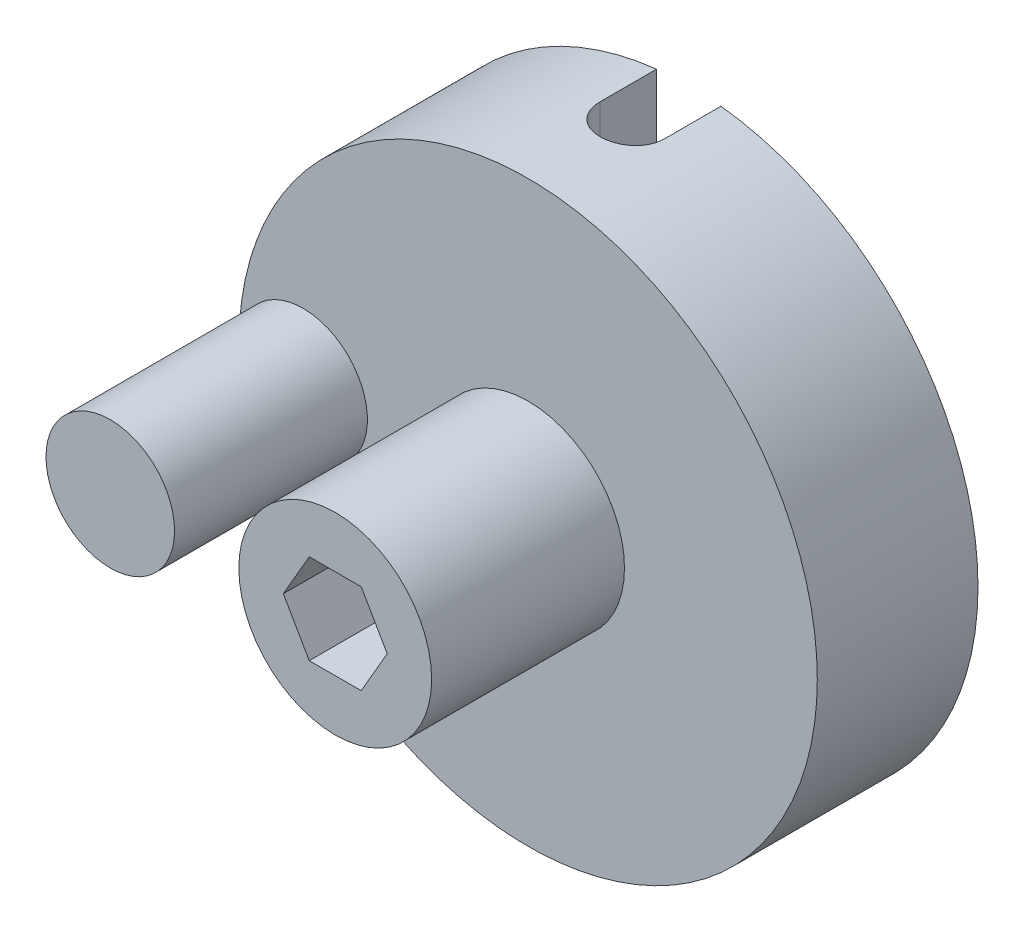
ISO-10303-21;
HEADER;
FILE_DESCRIPTION(('STEP AP214'),'2;1');
FILE_NAME('part.step','',(''),(''),'','','');
FILE_SCHEMA(('AUTOMOTIVE_DESIGN { 1 0 10303 214 1 1 1 1 }'));
ENDSEC;
DATA;
#1=APPLICATION_CONTEXT('core data for automotive mechanical design processes');
#2=APPLICATION_PROTOCOL_DEFINITION('international standard','automotive_design',2000,#1);
#3=PRODUCT_CONTEXT('',#1,'mechanical');
#4=PRODUCT('Part','Part','',(#3));
#5=PRODUCT_RELATED_PRODUCT_CATEGORY('part','',(#4));
#6=PRODUCT_DEFINITION_FORMATION('','',#4);
#7=PRODUCT_DEFINITION_CONTEXT('part definition',#1,'design');
#8=PRODUCT_DEFINITION('design','',#6,#7);
#9=PRODUCT_DEFINITION_SHAPE('','',#8);
#10=(LENGTH_UNIT() NAMED_UNIT(*) SI_UNIT(.MILLI.,.METRE.));
#11=(NAMED_UNIT(*) PLANE_ANGLE_UNIT() SI_UNIT($,.RADIAN.));
#12=(NAMED_UNIT(*) SI_UNIT($,.STERADIAN.) SOLID_ANGLE_UNIT());
#13=UNCERTAINTY_MEASURE_WITH_UNIT(LENGTH_MEASURE(1.E-05),#10,'distance_accuracy_value','');
#14=(GEOMETRIC_REPRESENTATION_CONTEXT(3) GLOBAL_UNCERTAINTY_ASSIGNED_CONTEXT((#13)) GLOBAL_UNIT_ASSIGNED_CONTEXT((#10,
#11,#12)) REPRESENTATION_CONTEXT('',''));
#15=CARTESIAN_POINT('',(0.,0.,0.));
#16=DIRECTION('',(0.,0.,1.));
#17=DIRECTION('',(1.,0.,0.));
#18=AXIS2_PLACEMENT_3D('',#15,#16,#17);
#19=CARTESIAN_POINT('',(-0.808290376865476,1.4,0.));
#20=DIRECTION('',(-0.866025403784439,0.5,0.));
#21=DIRECTION('',(-0.5,-0.866025403784439,0.));
#22=AXIS2_PLACEMENT_3D('',#19,#20,#21);
#23=PLANE('',#22);
#24=DIRECTION('',(-0.5,-0.866025403784439,0.));
#25=VECTOR('',#24,1.);
#26=CARTESIAN_POINT('',(-0.808290376865476,1.4,3.));
#27=LINE('',#26,#25);
#28=CARTESIAN_POINT('',(-0.808290376865477,1.4,3.));
#29=VERTEX_POINT('',#28);
#30=CARTESIAN_POINT('',(-1.61658075373095,0.,3.));
#31=VERTEX_POINT('',#30);
#32=EDGE_CURVE('E299',#29,#31,#27,.T.);
#33=ORIENTED_EDGE('',*,*,#32,.F.);
#34=DIRECTION('',(0.,0.,1.));
#35=VECTOR('',#34,1.);
#36=CARTESIAN_POINT('',(-0.808290376865476,1.4,0.));
#37=LINE('',#36,#35);
#38=CARTESIAN_POINT('',(-0.808290376865476,1.4,11.));
#39=VERTEX_POINT('',#38);
#40=EDGE_CURVE('E320',#29,#39,#37,.T.);
#41=ORIENTED_EDGE('',*,*,#40,.T.);
#42=DIRECTION('',(-0.5,-0.866025403784439,0.));
#43=VECTOR('',#42,1.);
#44=CARTESIAN_POINT('',(-0.808290376865476,1.4,11.));
#45=LINE('',#44,#43);
#46=CARTESIAN_POINT('',(-1.61658075373095,0.,11.));
#47=VERTEX_POINT('',#46);
#48=EDGE_CURVE('E301',#39,#47,#45,.T.);
#49=ORIENTED_EDGE('',*,*,#48,.T.);
#50=DIRECTION('',(0.,0.,1.));
#51=VECTOR('',#50,1.);
#52=CARTESIAN_POINT('',(-1.61658075373095,0.,0.));
#53=LINE('',#52,#51);
#54=EDGE_CURVE('E319',#31,#47,#53,.T.);
#55=ORIENTED_EDGE('',*,*,#54,.F.);
#56=EDGE_LOOP('',(#33,#41,#49,#55));
#57=FACE_BOUND('',#56,.T.);
#58=ADVANCED_FACE('F31',(#57),#23,.F.);
#59=CARTESIAN_POINT('',(0.808290376865476,1.4,0.));
#60=DIRECTION('',(0.,1.,0.));
#61=DIRECTION('',(0.,0.,1.));
#62=AXIS2_PLACEMENT_3D('',#59,#60,#61);
#63=PLANE('',#62);
#64=DIRECTION('',(-1.,0.,0.));
#65=VECTOR('',#64,1.);
#66=CARTESIAN_POINT('',(0.808290376865476,1.4,3.));
#67=LINE('',#66,#65);
#68=CARTESIAN_POINT('',(0.808290376865476,1.4,3.));
#69=VERTEX_POINT('',#68);
#70=EDGE_CURVE('E297',#69,#29,#67,.T.);
#71=ORIENTED_EDGE('',*,*,#70,.F.);
#72=DIRECTION('',(0.,0.,1.));
#73=VECTOR('',#72,1.);
#74=CARTESIAN_POINT('',(0.808290376865476,1.4,0.));
#75=LINE('',#74,#73);
#76=CARTESIAN_POINT('',(0.808290376865476,1.4,11.));
#77=VERTEX_POINT('',#76);
#78=EDGE_CURVE('E323',#69,#77,#75,.T.);
#79=ORIENTED_EDGE('',*,*,#78,.T.);
#80=DIRECTION('',(-1.,0.,0.));
#81=VECTOR('',#80,1.);
#82=CARTESIAN_POINT('',(0.808290376865476,1.4,11.));
#83=LINE('',#82,#81);
#84=EDGE_CURVE('E316',#77,#39,#83,.T.);
#85=ORIENTED_EDGE('',*,*,#84,.T.);
#86=ORIENTED_EDGE('',*,*,#40,.F.);
#87=EDGE_LOOP('',(#71,#79,#85,#86));
#88=FACE_BOUND('',#87,.T.);
#89=ADVANCED_FACE('F218',(#88),#63,.F.);
#90=CARTESIAN_POINT('',(1.61658075373095,0.,0.));
#91=DIRECTION('',(0.866025403784438,0.5,0.));
#92=DIRECTION('',(-0.5,0.866025403784439,0.));
#93=AXIS2_PLACEMENT_3D('',#90,#91,#92);
#94=PLANE('',#93);
#95=DIRECTION('',(-0.5,0.866025403784439,0.));
#96=VECTOR('',#95,1.);
#97=CARTESIAN_POINT('',(1.61658075373095,0.,3.));
#98=LINE('',#97,#96);
#99=CARTESIAN_POINT('',(1.61658075373095,0.,3.));
#100=VERTEX_POINT('',#99);
#101=EDGE_CURVE('E295',#100,#69,#98,.T.);
#102=ORIENTED_EDGE('',*,*,#101,.F.);
#103=DIRECTION('',(0.,0.,1.));
#104=VECTOR('',#103,1.);
#105=CARTESIAN_POINT('',(1.61658075373095,0.,0.));
#106=LINE('',#105,#104);
#107=CARTESIAN_POINT('',(1.61658075373095,0.,11.));
#108=VERTEX_POINT('',#107);
#109=EDGE_CURVE('E325',#100,#108,#106,.T.);
#110=ORIENTED_EDGE('',*,*,#109,.T.);
#111=DIRECTION('',(-0.5,0.866025403784439,0.));
#112=VECTOR('',#111,1.);
#113=CARTESIAN_POINT('',(1.61658075373095,0.,11.));
#114=LINE('',#113,#112);
#115=EDGE_CURVE('E313',#108,#77,#114,.T.);
#116=ORIENTED_EDGE('',*,*,#115,.T.);
#117=ORIENTED_EDGE('',*,*,#78,.F.);
#118=EDGE_LOOP('',(#102,#110,#116,#117));
#119=FACE_BOUND('',#118,.T.);
#120=ADVANCED_FACE('F221',(#119),#94,.F.);
#121=CARTESIAN_POINT('',(0.808290376865476,-1.4,0.));
#122=DIRECTION('',(0.866025403784439,-0.5,0.));
#123=DIRECTION('',(0.5,0.866025403784439,0.));
#124=AXIS2_PLACEMENT_3D('',#121,#122,#123);
#125=PLANE('',#124);
#126=DIRECTION('',(0.5,0.866025403784439,0.));
#127=VECTOR('',#126,1.);
#128=CARTESIAN_POINT('',(0.808290376865476,-1.4,3.));
#129=LINE('',#128,#127);
#130=CARTESIAN_POINT('',(0.808290376865477,-1.4,3.));
#131=VERTEX_POINT('',#130);
#132=EDGE_CURVE('E293',#131,#100,#129,.T.);
#133=ORIENTED_EDGE('',*,*,#132,.F.);
#134=DIRECTION('',(0.,0.,1.));
#135=VECTOR('',#134,1.);
#136=CARTESIAN_POINT('',(0.808290376865476,-1.4,0.));
#137=LINE('',#136,#135);
#138=CARTESIAN_POINT('',(0.808290376865476,-1.4,11.));
#139=VERTEX_POINT('',#138);
#140=EDGE_CURVE('E327',#131,#139,#137,.T.);
#141=ORIENTED_EDGE('',*,*,#140,.T.);
#142=DIRECTION('',(0.5,0.866025403784439,0.));
#143=VECTOR('',#142,1.);
#144=CARTESIAN_POINT('',(0.808290376865476,-1.4,11.));
#145=LINE('',#144,#143);
#146=EDGE_CURVE('E310',#139,#108,#145,.T.);
#147=ORIENTED_EDGE('',*,*,#146,.T.);
#148=ORIENTED_EDGE('',*,*,#109,.F.);
#149=EDGE_LOOP('',(#133,#141,#147,#148));
#150=FACE_BOUND('',#149,.T.);
#151=ADVANCED_FACE('F225',(#150),#125,.F.);
#152=CARTESIAN_POINT('',(-0.808290376865476,-1.4,0.));
#153=DIRECTION('',(0.,-1.,0.));
#154=DIRECTION('',(0.,0.,-1.));
#155=AXIS2_PLACEMENT_3D('',#152,#153,#154);
#156=PLANE('',#155);
#157=DIRECTION('',(1.,0.,0.));
#158=VECTOR('',#157,1.);
#159=CARTESIAN_POINT('',(-0.808290376865476,-1.4,3.));
#160=LINE('',#159,#158);
#161=CARTESIAN_POINT('',(-0.808290376865476,-1.4,3.));
#162=VERTEX_POINT('',#161);
#163=EDGE_CURVE('E280',#162,#131,#160,.T.);
#164=ORIENTED_EDGE('',*,*,#163,.F.);
#165=DIRECTION('',(0.,0.,1.));
#166=VECTOR('',#165,1.);
#167=CARTESIAN_POINT('',(-0.808290376865476,-1.4,0.));
#168=LINE('',#167,#166);
#169=CARTESIAN_POINT('',(-0.808290376865476,-1.4,11.));
#170=VERTEX_POINT('',#169);
#171=EDGE_CURVE('E329',#162,#170,#168,.T.);
#172=ORIENTED_EDGE('',*,*,#171,.T.);
#173=DIRECTION('',(1.,0.,0.));
#174=VECTOR('',#173,1.);
#175=CARTESIAN_POINT('',(-0.808290376865476,-1.4,11.));
#176=LINE('',#175,#174);
#177=EDGE_CURVE('E307',#170,#139,#176,.T.);
#178=ORIENTED_EDGE('',*,*,#177,.T.);
#179=ORIENTED_EDGE('',*,*,#140,.F.);
#180=EDGE_LOOP('',(#164,#172,#178,#179));
#181=FACE_BOUND('',#180,.T.);
#182=ADVANCED_FACE('F229',(#181),#156,.F.);
#183=CARTESIAN_POINT('',(-1.61658075373095,0.,0.));
#184=DIRECTION('',(-0.866025403784439,-0.5,0.));
#185=DIRECTION('',(0.5,-0.866025403784439,0.));
#186=AXIS2_PLACEMENT_3D('',#183,#184,#185);
#187=PLANE('',#186);
#188=DIRECTION('',(0.5,-0.866025403784439,0.));
#189=VECTOR('',#188,1.);
#190=CARTESIAN_POINT('',(-1.61658075373095,0.,3.));
#191=LINE('',#190,#189);
#192=EDGE_CURVE('E40',#31,#162,#191,.T.);
#193=ORIENTED_EDGE('',*,*,#192,.F.);
#194=ORIENTED_EDGE('',*,*,#54,.T.);
#195=DIRECTION('',(0.5,-0.866025403784439,0.));
#196=VECTOR('',#195,1.);
#197=CARTESIAN_POINT('',(-1.61658075373095,0.,11.));
#198=LINE('',#197,#196);
#199=EDGE_CURVE('E304',#47,#170,#198,.T.);
#200=ORIENTED_EDGE('',*,*,#199,.T.);
#201=ORIENTED_EDGE('',*,*,#171,.F.);
#202=EDGE_LOOP('',(#193,#194,#200,#201));
#203=FACE_BOUND('',#202,.T.);
#204=ADVANCED_FACE('F233',(#203),#187,.F.);
#205=CARTESIAN_POINT('',(0.,0.,5.));
#206=DIRECTION('',(0.,0.,1.));
#207=DIRECTION('',(1.,0.,0.));
#208=AXIS2_PLACEMENT_3D('',#205,#206,#207);
#209=PLANE('',#208);
#210=CARTESIAN_POINT('',(0.,0.,5.));
#211=DIRECTION('',(0.,0.,1.));
#212=DIRECTION('',(1.,0.,0.));
#213=AXIS2_PLACEMENT_3D('',#210,#211,#212);
#214=CIRCLE('',#213,3.);
#215=CARTESIAN_POINT('',(3.,0.,5.));
#216=VERTEX_POINT('',#215);
#217=EDGE_CURVE('E335',#216,#216,#214,.T.);
#218=ORIENTED_EDGE('',*,*,#217,.F.);
#219=EDGE_LOOP('',(#218));
#220=FACE_BOUND('',#219,.T.);
#221=CARTESIAN_POINT('',(0.,0.,5.));
#222=DIRECTION('',(0.,0.,1.));
#223=DIRECTION('',(1.,0.,0.));
#224=AXIS2_PLACEMENT_3D('',#221,#222,#223);
#225=CIRCLE('',#224,9.);
#226=CARTESIAN_POINT('',(-9.,0.,5.));
#227=VERTEX_POINT('',#226);
#228=EDGE_CURVE('E343',#227,#227,#225,.T.);
#229=ORIENTED_EDGE('',*,*,#228,.T.);
#230=CARTESIAN_POINT('',(-7.,0.,5.));
#231=DIRECTION('',(0.,0.,1.));
#232=DIRECTION('',(1.,0.,0.));
#233=AXIS2_PLACEMENT_3D('',#230,#231,#232);
#234=CIRCLE('',#233,2.);
#235=EDGE_CURVE('E322',#227,#227,#234,.T.);
#236=ORIENTED_EDGE('',*,*,#235,.F.);
#237=EDGE_LOOP('',(#229,#236));
#238=FACE_BOUND('',#237,.T.);
#239=ADVANCED_FACE('F237',(#220,#238),#209,.T.);
#240=CARTESIAN_POINT('',(0.,0.,5.));
#241=DIRECTION('',(0.,0.,-1.));
#242=DIRECTION('',(-1.,0.,0.));
#243=AXIS2_PLACEMENT_3D('',#240,#241,#242);
#244=CYLINDRICAL_SURFACE('',#243,9.);
#245=ORIENTED_EDGE('',*,*,#228,.F.);
#246=EDGE_LOOP('',(#245));
#247=FACE_BOUND('',#246,.T.);
#248=CARTESIAN_POINT('',(0.,0.,0.));
#249=DIRECTION('',(0.,0.,1.));
#250=DIRECTION('',(1.,0.,0.));
#251=AXIS2_PLACEMENT_3D('',#248,#249,#250);
#252=CIRCLE('',#251,9.);
#253=CARTESIAN_POINT('',(-0.999999999999998,8.94427190999916,0.));
#254=VERTEX_POINT('',#253);
#255=CARTESIAN_POINT('',(1.,8.94427190999916,0.));
#256=VERTEX_POINT('',#255);
#257=EDGE_CURVE('E340',#254,#256,#252,.T.);
#258=ORIENTED_EDGE('',*,*,#257,.T.);
#259=DIRECTION('',(0.,0.,-1.));
#260=VECTOR('',#259,1.);
#261=CARTESIAN_POINT('',(1.,8.94427190999916,5.));
#262=LINE('',#261,#260);
#263=CARTESIAN_POINT('',(1.,8.94427190999916,1.75624966868781));
#264=VERTEX_POINT('',#263);
#265=EDGE_CURVE('E177',#256,#264,#262,.F.);
#266=ORIENTED_EDGE('',*,*,#265,.T.);
#267=CARTESIAN_POINT('',(1.,8.94427190999916,1.75624966868781));
#268=CARTESIAN_POINT('',(0.999999916663173,8.94427115416526,1.78429133160942));
#269=CARTESIAN_POINT('',(0.998819755404154,8.94440395043972,1.81231947522258));
#270=CARTESIAN_POINT('',(0.994112290071172,8.94492867723731,1.86817349896722));
#271=CARTESIAN_POINT('',(0.990585152282366,8.94532058940187,1.89599939328704));
#272=CARTESIAN_POINT('',(0.976519887916943,8.9468711629412,1.97881472627213));
#273=CARTESIAN_POINT('',(0.962497798537733,8.94840471911578,2.03324672375495));
#274=CARTESIAN_POINT('',(0.925564954935866,8.95229970936664,2.1389639463873));
#275=CARTESIAN_POINT('',(0.902651036418025,8.9546614381321,2.19024804377473));
#276=CARTESIAN_POINT('',(0.848592815070569,8.95994559153617,2.28824558603894));
#277=CARTESIAN_POINT('',(0.817449357990867,8.9628679585495,2.33495949991802));
#278=CARTESIAN_POINT('',(0.74767213384802,8.96895834846973,2.42268832970838));
#279=CARTESIAN_POINT('',(0.709009815966534,8.97212727921224,2.46368046599398));
#280=CARTESIAN_POINT('',(0.625348520349966,8.97834591313882,2.53861343115112));
#281=CARTESIAN_POINT('',(0.580348579191626,8.98139559810534,2.57255318599897));
#282=CARTESIAN_POINT('',(0.48514905414561,8.9870410281107,2.63249299378261));
#283=CARTESIAN_POINT('',(0.434936368504785,8.98963558298816,2.65847235889332));
#284=CARTESIAN_POINT('',(0.330830504554187,8.99406818174326,2.70162030391601));
#285=CARTESIAN_POINT('',(0.276937655877063,8.99590629327227,2.71878967177067));
#286=CARTESIAN_POINT('',(0.167234674124459,8.99861262236768,2.74376376625514));
#287=CARTESIAN_POINT('',(0.111433378381948,8.99948481412383,2.75160687483939));
#288=CARTESIAN_POINT('',(-0.000701187042490368,9.00017458214887,2.75782470520331));
#289=CARTESIAN_POINT('',(-0.0570344528927511,8.9999921660081,2.7561994951294));
#290=CARTESIAN_POINT('',(-0.168370018408367,8.99859646961496,2.74355747129341));
#291=CARTESIAN_POINT('',(-0.223377100451679,8.99738774941592,2.73258220080991));
#292=CARTESIAN_POINT('',(-0.330763409468756,8.9940804590329,2.70161646145195));
#293=CARTESIAN_POINT('',(-0.383142609178625,8.99198187961889,2.68162589906664));
#294=CARTESIAN_POINT('',(-0.483917540161101,8.9871228456453,2.63315163900534));
#295=CARTESIAN_POINT('',(-0.532304358111638,8.98436096120363,2.60464956035006));
#296=CARTESIAN_POINT('',(-0.623621368948409,8.9784850191985,2.53997590987187));
#297=CARTESIAN_POINT('',(-0.666551602030159,8.9753709642296,2.50380439455052));
#298=CARTESIAN_POINT('',(-0.745977303006888,8.96912017299343,2.42459118944073));
#299=CARTESIAN_POINT('',(-0.782437642872812,8.96598340371819,2.38151427532033));
#300=CARTESIAN_POINT('',(-0.847626568506839,8.96005605482345,2.28981665745839));
#301=CARTESIAN_POINT('',(-0.876352825703826,8.95726557960189,2.24119429035532));
#302=CARTESIAN_POINT('',(-0.925258151139518,8.95234630600339,2.13975072441991));
#303=CARTESIAN_POINT('',(-0.945429663936238,8.9502180929678,2.08692586268584));
#304=CARTESIAN_POINT('',(-0.976576500550566,8.94687363542662,1.97864881146696));
#305=CARTESIAN_POINT('',(-0.987565708258682,8.94565601437542,1.92320072300691));
#306=CARTESIAN_POINT('',(-0.995878229146715,8.9447318694184,1.84884156747438));
#307=CARTESIAN_POINT('',(-0.997424646598037,8.94455949934616,1.83034097667583));
#308=CARTESIAN_POINT('',(-0.999484141877985,8.94432965826436,1.79331273511982));
#309=CARTESIAN_POINT('',(-0.999998947367566,8.94427199515397,1.77478518169361));
#310=CARTESIAN_POINT('',(-0.999999999999998,8.94427190999916,1.75624966868782));
#311=B_SPLINE_CURVE_WITH_KNOTS('',3,(#267,#268,#269,#270,#271,#272,#273,#274,#275,#276,#277,
#278,#279,#280,#281,#282,#283,#284,#285,#286,#287,#288,#289,#290,#291,#292,#293,#294,#295,#296,
#297,#298,#299,#300,#301,#302,#303,#304,#305,#306,#307,#308,#309,#310),.UNSPECIFIED.,.F.,.F.,(4,
2,2,2,2,2,2,2,2,2,2,2,2,2,2,2,2,2,2,2,2,4),(0.,0.0840730446599406,0.168140133311819,
0.335963609492455,0.503846863107502,0.671712870061393,0.840229207400693,1.00877118970891,
1.17774754254328,1.3467087799477,1.51497222864922,1.68323446630792,1.85075297343597,
2.01827321818486,2.18615787881024,2.35404130265442,2.5228100698145,2.69162959305411,
2.86059790661905,3.02931027087838,3.08498698762154,3.14057038327783),.UNSPECIFIED.);
#312=CARTESIAN_POINT('',(-0.999999999999998,8.94427190999916,1.75624966868781));
#313=VERTEX_POINT('',#312);
#314=EDGE_CURVE('E152',#264,#313,#311,.T.);
#315=ORIENTED_EDGE('',*,*,#314,.T.);
#316=DIRECTION('',(0.,0.,-1.));
#317=VECTOR('',#316,1.);
#318=CARTESIAN_POINT('',(-0.999999999999998,8.94427190999916,5.));
#319=LINE('',#318,#317);
#320=EDGE_CURVE('E173',#313,#254,#319,.T.);
#321=ORIENTED_EDGE('',*,*,#320,.T.);
#322=EDGE_LOOP('',(#258,#266,#315,#321));
#323=FACE_BOUND('',#322,.T.);
#324=ADVANCED_FACE('F33',(#247,#323),#244,.T.);
#325=CARTESIAN_POINT('',(0.,0.,0.));
#326=DIRECTION('',(0.,0.,1.));
#327=DIRECTION('',(1.,0.,0.));
#328=AXIS2_PLACEMENT_3D('',#325,#326,#327);
#329=PLANE('',#328);
#330=DIRECTION('',(1.,0.,0.));
#331=VECTOR('',#330,1.);
#332=CARTESIAN_POINT('',(-2.04959345562317,3.55,0.));
#333=LINE('',#332,#331);
#334=CARTESIAN_POINT('',(1.,3.55,0.));
#335=VERTEX_POINT('',#334);
#336=CARTESIAN_POINT('',(2.04959345562317,3.55,0.));
#337=VERTEX_POINT('',#336);
#338=EDGE_CURVE('E266',#335,#337,#333,.T.);
#339=ORIENTED_EDGE('',*,*,#338,.F.);
#340=DIRECTION('',(0.,1.,0.));
#341=VECTOR('',#340,1.);
#342=CARTESIAN_POINT('',(1.,0.,0.));
#343=LINE('',#342,#341);
#344=EDGE_CURVE('E160',#335,#256,#343,.T.);
#345=ORIENTED_EDGE('',*,*,#344,.T.);
#346=ORIENTED_EDGE('',*,*,#257,.F.);
#347=DIRECTION('',(0.,-1.,0.));
#348=VECTOR('',#347,1.);
#349=CARTESIAN_POINT('',(-1.,0.,0.));
#350=LINE('',#349,#348);
#351=CARTESIAN_POINT('',(-0.999999999999999,3.55,0.));
#352=VERTEX_POINT('',#351);
#353=EDGE_CURVE('E155',#254,#352,#350,.T.);
#354=ORIENTED_EDGE('',*,*,#353,.T.);
#355=CARTESIAN_POINT('',(-2.04959345562317,3.55,0.));
#356=VERTEX_POINT('',#355);
#357=EDGE_CURVE('E270',#356,#352,#333,.T.);
#358=ORIENTED_EDGE('',*,*,#357,.F.);
#359=DIRECTION('',(0.5,0.866025403784439,0.));
#360=VECTOR('',#359,1.);
#361=CARTESIAN_POINT('',(-4.09918691124634,0.,0.));
#362=LINE('',#361,#360);
#363=CARTESIAN_POINT('',(-4.09918691124634,0.,0.));
#364=VERTEX_POINT('',#363);
#365=EDGE_CURVE('E271',#364,#356,#362,.T.);
#366=ORIENTED_EDGE('',*,*,#365,.F.);
#367=DIRECTION('',(-0.5,0.866025403784439,0.));
#368=VECTOR('',#367,1.);
#369=CARTESIAN_POINT('',(-2.04959345562317,-3.55,0.));
#370=LINE('',#369,#368);
#371=CARTESIAN_POINT('',(-2.04959345562317,-3.55,0.));
#372=VERTEX_POINT('',#371);
#373=EDGE_CURVE('E274',#372,#364,#370,.T.);
#374=ORIENTED_EDGE('',*,*,#373,.F.);
#375=DIRECTION('',(-1.,0.,0.));
#376=VECTOR('',#375,1.);
#377=CARTESIAN_POINT('',(2.04959345562317,-3.55,0.));
#378=LINE('',#377,#376);
#379=CARTESIAN_POINT('',(2.04959345562317,-3.55,0.));
#380=VERTEX_POINT('',#379);
#381=EDGE_CURVE('E384',#380,#372,#378,.T.);
#382=ORIENTED_EDGE('',*,*,#381,.F.);
#383=DIRECTION('',(-0.5,-0.866025403784439,0.));
#384=VECTOR('',#383,1.);
#385=CARTESIAN_POINT('',(4.09918691124634,0.,0.));
#386=LINE('',#385,#384);
#387=CARTESIAN_POINT('',(4.09918691124634,0.,0.));
#388=VERTEX_POINT('',#387);
#389=EDGE_CURVE('E385',#388,#380,#386,.T.);
#390=ORIENTED_EDGE('',*,*,#389,.F.);
#391=DIRECTION('',(0.5,-0.866025403784439,0.));
#392=VECTOR('',#391,1.);
#393=CARTESIAN_POINT('',(2.04959345562317,3.55,0.));
#394=LINE('',#393,#392);
#395=EDGE_CURVE('E55',#337,#388,#394,.T.);
#396=ORIENTED_EDGE('',*,*,#395,.F.);
#397=EDGE_LOOP('',(#339,#345,#346,#354,#358,#366,#374,#382,#390,#396));
#398=FACE_BOUND('',#397,.T.);
#399=ADVANCED_FACE('F256',(#398),#329,.F.);
#400=CARTESIAN_POINT('',(0.,0.,11.));
#401=DIRECTION('',(0.,0.,-1.));
#402=DIRECTION('',(-1.,0.,0.));
#403=AXIS2_PLACEMENT_3D('',#400,#401,#402);
#404=CYLINDRICAL_SURFACE('',#403,3.);
#405=CARTESIAN_POINT('',(0.,0.,11.));
#406=DIRECTION('',(0.,0.,1.));
#407=DIRECTION('',(1.,0.,0.));
#408=AXIS2_PLACEMENT_3D('',#405,#406,#407);
#409=CIRCLE('',#408,3.);
#410=CARTESIAN_POINT('',(3.,0.,11.));
#411=VERTEX_POINT('',#410);
#412=EDGE_CURVE('E337',#411,#411,#409,.T.);
#413=ORIENTED_EDGE('',*,*,#412,.F.);
#414=EDGE_LOOP('',(#413));
#415=FACE_BOUND('',#414,.T.);
#416=ORIENTED_EDGE('',*,*,#217,.T.);
#417=EDGE_LOOP('',(#416));
#418=FACE_BOUND('',#417,.T.);
#419=ADVANCED_FACE('F252',(#415,#418),#404,.T.);
#420=CARTESIAN_POINT('',(0.,0.,11.));
#421=DIRECTION('',(0.,0.,1.));
#422=DIRECTION('',(1.,0.,0.));
#423=AXIS2_PLACEMENT_3D('',#420,#421,#422);
#424=PLANE('',#423);
#425=ORIENTED_EDGE('',*,*,#48,.F.);
#426=ORIENTED_EDGE('',*,*,#84,.F.);
#427=ORIENTED_EDGE('',*,*,#115,.F.);
#428=ORIENTED_EDGE('',*,*,#146,.F.);
#429=ORIENTED_EDGE('',*,*,#177,.F.);
#430=ORIENTED_EDGE('',*,*,#199,.F.);
#431=EDGE_LOOP('',(#425,#426,#427,#428,#429,#430));
#432=FACE_BOUND('',#431,.T.);
#433=ORIENTED_EDGE('',*,*,#412,.T.);
#434=EDGE_LOOP('',(#433));
#435=FACE_BOUND('',#434,.T.);
#436=ADVANCED_FACE('F248',(#432,#435),#424,.T.);
#437=CARTESIAN_POINT('',(-7.,0.,11.));
#438=DIRECTION('',(0.,0.,-1.));
#439=DIRECTION('',(-1.,0.,0.));
#440=AXIS2_PLACEMENT_3D('',#437,#438,#439);
#441=CYLINDRICAL_SURFACE('',#440,2.);
#442=CARTESIAN_POINT('',(-7.,0.,11.));
#443=DIRECTION('',(0.,0.,1.));
#444=DIRECTION('',(1.,0.,0.));
#445=AXIS2_PLACEMENT_3D('',#442,#443,#444);
#446=CIRCLE('',#445,2.);
#447=CARTESIAN_POINT('',(-5.,0.,11.));
#448=VERTEX_POINT('',#447);
#449=EDGE_CURVE('E332',#448,#448,#446,.T.);
#450=ORIENTED_EDGE('',*,*,#449,.F.);
#451=EDGE_LOOP('',(#450));
#452=FACE_BOUND('',#451,.T.);
#453=ORIENTED_EDGE('',*,*,#235,.T.);
#454=EDGE_LOOP('',(#453));
#455=FACE_BOUND('',#454,.T.);
#456=ADVANCED_FACE('F244',(#452,#455),#441,.T.);
#457=CARTESIAN_POINT('',(-7.,0.,11.));
#458=DIRECTION('',(0.,0.,1.));
#459=DIRECTION('',(1.,0.,0.));
#460=AXIS2_PLACEMENT_3D('',#457,#458,#459);
#461=PLANE('',#460);
#462=ORIENTED_EDGE('',*,*,#449,.T.);
#463=EDGE_LOOP('',(#462));
#464=FACE_BOUND('',#463,.T.);
#465=ADVANCED_FACE('F197',(#464),#461,.T.);
#466=CARTESIAN_POINT('',(4.09918691124634,0.,3.));
#467=DIRECTION('',(0.,0.,-1.));
#468=DIRECTION('',(-1.,0.,0.));
#469=AXIS2_PLACEMENT_3D('',#466,#467,#468);
#470=PLANE('',#469);
#471=DIRECTION('',(0.5,-0.866025403784439,0.));
#472=VECTOR('',#471,1.);
#473=CARTESIAN_POINT('',(2.04959345562317,3.55,3.));
#474=LINE('',#473,#472);
#475=CARTESIAN_POINT('',(2.04959345562317,3.55,3.));
#476=VERTEX_POINT('',#475);
#477=CARTESIAN_POINT('',(4.09918691124634,0.,3.));
#478=VERTEX_POINT('',#477);
#479=EDGE_CURVE('E184',#476,#478,#474,.T.);
#480=ORIENTED_EDGE('',*,*,#479,.T.);
#481=DIRECTION('',(-0.5,-0.866025403784439,0.));
#482=VECTOR('',#481,1.);
#483=CARTESIAN_POINT('',(4.09918691124634,0.,3.));
#484=LINE('',#483,#482);
#485=CARTESIAN_POINT('',(2.04959345562317,-3.55,3.));
#486=VERTEX_POINT('',#485);
#487=EDGE_CURVE('E399',#478,#486,#484,.T.);
#488=ORIENTED_EDGE('',*,*,#487,.T.);
#489=DIRECTION('',(-1.,0.,0.));
#490=VECTOR('',#489,1.);
#491=CARTESIAN_POINT('',(2.04959345562317,-3.55,3.));
#492=LINE('',#491,#490);
#493=CARTESIAN_POINT('',(-2.04959345562317,-3.55,3.));
#494=VERTEX_POINT('',#493);
#495=EDGE_CURVE('E397',#486,#494,#492,.T.);
#496=ORIENTED_EDGE('',*,*,#495,.T.);
#497=DIRECTION('',(-0.5,0.866025403784439,0.));
#498=VECTOR('',#497,1.);
#499=CARTESIAN_POINT('',(-2.04959345562317,-3.55,3.));
#500=LINE('',#499,#498);
#501=CARTESIAN_POINT('',(-4.09918691124634,0.,3.));
#502=VERTEX_POINT('',#501);
#503=EDGE_CURVE('E394',#494,#502,#500,.T.);
#504=ORIENTED_EDGE('',*,*,#503,.T.);
#505=DIRECTION('',(0.5,0.866025403784439,0.));
#506=VECTOR('',#505,1.);
#507=CARTESIAN_POINT('',(-4.09918691124634,0.,3.));
#508=LINE('',#507,#506);
#509=CARTESIAN_POINT('',(-2.04959345562317,3.55,3.));
#510=VERTEX_POINT('',#509);
#511=EDGE_CURVE('E392',#502,#510,#508,.T.);
#512=ORIENTED_EDGE('',*,*,#511,.T.);
#513=DIRECTION('',(1.,0.,0.));
#514=VECTOR('',#513,1.);
#515=CARTESIAN_POINT('',(-2.04959345562317,3.55,3.));
#516=LINE('',#515,#514);
#517=EDGE_CURVE('E291',#510,#476,#516,.T.);
#518=ORIENTED_EDGE('',*,*,#517,.T.);
#519=EDGE_LOOP('',(#480,#488,#496,#504,#512,#518));
#520=FACE_BOUND('',#519,.T.);
#521=ORIENTED_EDGE('',*,*,#32,.T.);
#522=ORIENTED_EDGE('',*,*,#192,.T.);
#523=ORIENTED_EDGE('',*,*,#163,.T.);
#524=ORIENTED_EDGE('',*,*,#132,.T.);
#525=ORIENTED_EDGE('',*,*,#101,.T.);
#526=ORIENTED_EDGE('',*,*,#70,.T.);
#527=EDGE_LOOP('',(#521,#522,#523,#524,#525,#526));
#528=FACE_BOUND('',#527,.T.);
#529=ADVANCED_FACE('F193',(#520,#528),#470,.T.);
#530=CARTESIAN_POINT('',(2.04959345562317,3.55,3.));
#531=DIRECTION('',(0.866025403784439,0.499999999999999,0.));
#532=DIRECTION('',(-0.5,0.866025403784439,0.));
#533=AXIS2_PLACEMENT_3D('',#530,#531,#532);
#534=PLANE('',#533);
#535=ORIENTED_EDGE('',*,*,#395,.T.);
#536=DIRECTION('',(0.,0.,-1.));
#537=VECTOR('',#536,1.);
#538=CARTESIAN_POINT('',(4.09918691124634,0.,3.));
#539=LINE('',#538,#537);
#540=EDGE_CURVE('E289',#478,#388,#539,.T.);
#541=ORIENTED_EDGE('',*,*,#540,.F.);
#542=ORIENTED_EDGE('',*,*,#479,.F.);
#543=DIRECTION('',(0.,0.,-1.));
#544=VECTOR('',#543,1.);
#545=CARTESIAN_POINT('',(2.04959345562317,3.55,3.));
#546=LINE('',#545,#544);
#547=EDGE_CURVE('E278',#476,#337,#546,.T.);
#548=ORIENTED_EDGE('',*,*,#547,.T.);
#549=EDGE_LOOP('',(#535,#541,#542,#548));
#550=FACE_BOUND('',#549,.T.);
#551=ADVANCED_FACE('F196',(#550),#534,.F.);
#552=CARTESIAN_POINT('',(-2.04959345562317,3.55,3.));
#553=DIRECTION('',(0.,1.,0.));
#554=DIRECTION('',(-1.,0.,0.));
#555=AXIS2_PLACEMENT_3D('',#552,#553,#554);
#556=PLANE('',#555);
#557=CARTESIAN_POINT('',(0.,3.55,1.75624966868781));
#558=DIRECTION('',(0.,-1.,0.));
#559=DIRECTION('',(1.,0.,0.));
#560=AXIS2_PLACEMENT_3D('',#557,#558,#559);
#561=CIRCLE('',#560,1.);
#562=CARTESIAN_POINT('',(1.,3.55,1.75624966868781));
#563=VERTEX_POINT('',#562);
#564=CARTESIAN_POINT('',(-0.999999999999999,3.55,1.75624966868781));
#565=VERTEX_POINT('',#564);
#566=EDGE_CURVE('E47',#563,#565,#561,.T.);
#567=ORIENTED_EDGE('',*,*,#566,.F.);
#568=DIRECTION('',(0.,0.,-1.));
#569=VECTOR('',#568,1.);
#570=CARTESIAN_POINT('',(1.,3.55,3.));
#571=LINE('',#570,#569);
#572=EDGE_CURVE('E11',#563,#335,#571,.T.);
#573=ORIENTED_EDGE('',*,*,#572,.T.);
#574=ORIENTED_EDGE('',*,*,#338,.T.);
#575=ORIENTED_EDGE('',*,*,#547,.F.);
#576=ORIENTED_EDGE('',*,*,#517,.F.);
#577=DIRECTION('',(0.,0.,-1.));
#578=VECTOR('',#577,1.);
#579=CARTESIAN_POINT('',(-2.04959345562317,3.55,3.));
#580=LINE('',#579,#578);
#581=EDGE_CURVE('E281',#510,#356,#580,.T.);
#582=ORIENTED_EDGE('',*,*,#581,.T.);
#583=ORIENTED_EDGE('',*,*,#357,.T.);
#584=DIRECTION('',(0.,0.,-1.));
#585=VECTOR('',#584,1.);
#586=CARTESIAN_POINT('',(-0.999999999999999,3.55,1.75624966868781));
#587=LINE('',#586,#585);
#588=EDGE_CURVE('E166',#565,#352,#587,.T.);
#589=ORIENTED_EDGE('',*,*,#588,.F.);
#590=EDGE_LOOP('',(#567,#573,#574,#575,#576,#582,#583,#589));
#591=FACE_BOUND('',#590,.T.);
#592=ADVANCED_FACE('F164',(#591),#556,.F.);
#593=CARTESIAN_POINT('',(-4.09918691124634,0.,3.));
#594=DIRECTION('',(-0.866025403784439,0.5,0.));
#595=DIRECTION('',(-0.5,-0.866025403784439,0.));
#596=AXIS2_PLACEMENT_3D('',#593,#594,#595);
#597=PLANE('',#596);
#598=ORIENTED_EDGE('',*,*,#365,.T.);
#599=ORIENTED_EDGE('',*,*,#581,.F.);
#600=ORIENTED_EDGE('',*,*,#511,.F.);
#601=DIRECTION('',(0.,0.,-1.));
#602=VECTOR('',#601,1.);
#603=CARTESIAN_POINT('',(-4.09918691124634,0.,3.));
#604=LINE('',#603,#602);
#605=EDGE_CURVE('E283',#502,#364,#604,.T.);
#606=ORIENTED_EDGE('',*,*,#605,.T.);
#607=EDGE_LOOP('',(#598,#599,#600,#606));
#608=FACE_BOUND('',#607,.T.);
#609=ADVANCED_FACE('F201',(#608),#597,.F.);
#610=CARTESIAN_POINT('',(-2.04959345562317,-3.55,3.));
#611=DIRECTION('',(-0.866025403784439,-0.5,0.));
#612=DIRECTION('',(0.5,-0.866025403784439,0.));
#613=AXIS2_PLACEMENT_3D('',#610,#611,#612);
#614=PLANE('',#613);
#615=ORIENTED_EDGE('',*,*,#373,.T.);
#616=ORIENTED_EDGE('',*,*,#605,.F.);
#617=ORIENTED_EDGE('',*,*,#503,.F.);
#618=DIRECTION('',(0.,0.,-1.));
#619=VECTOR('',#618,1.);
#620=CARTESIAN_POINT('',(-2.04959345562317,-3.55,3.));
#621=LINE('',#620,#619);
#622=EDGE_CURVE('E285',#494,#372,#621,.T.);
#623=ORIENTED_EDGE('',*,*,#622,.T.);
#624=EDGE_LOOP('',(#615,#616,#617,#623));
#625=FACE_BOUND('',#624,.T.);
#626=ADVANCED_FACE('F204',(#625),#614,.F.);
#627=CARTESIAN_POINT('',(2.04959345562317,-3.55,3.));
#628=DIRECTION('',(0.,-1.,0.));
#629=DIRECTION('',(1.,0.,0.));
#630=AXIS2_PLACEMENT_3D('',#627,#628,#629);
#631=PLANE('',#630);
#632=ORIENTED_EDGE('',*,*,#381,.T.);
#633=ORIENTED_EDGE('',*,*,#622,.F.);
#634=ORIENTED_EDGE('',*,*,#495,.F.);
#635=DIRECTION('',(0.,0.,-1.));
#636=VECTOR('',#635,1.);
#637=CARTESIAN_POINT('',(2.04959345562317,-3.55,3.));
#638=LINE('',#637,#636);
#639=EDGE_CURVE('E287',#486,#380,#638,.T.);
#640=ORIENTED_EDGE('',*,*,#639,.T.);
#641=EDGE_LOOP('',(#632,#633,#634,#640));
#642=FACE_BOUND('',#641,.T.);
#643=ADVANCED_FACE('F208',(#642),#631,.F.);
#644=CARTESIAN_POINT('',(4.09918691124634,0.,3.));
#645=DIRECTION('',(0.866025403784439,-0.5,0.));
#646=DIRECTION('',(0.5,0.866025403784439,0.));
#647=AXIS2_PLACEMENT_3D('',#644,#645,#646);
#648=PLANE('',#647);
#649=ORIENTED_EDGE('',*,*,#389,.T.);
#650=ORIENTED_EDGE('',*,*,#639,.F.);
#651=ORIENTED_EDGE('',*,*,#487,.F.);
#652=ORIENTED_EDGE('',*,*,#540,.T.);
#653=EDGE_LOOP('',(#649,#650,#651,#652));
#654=FACE_BOUND('',#653,.T.);
#655=ADVANCED_FACE('F190',(#654),#648,.F.);
#656=CARTESIAN_POINT('',(0.,11.55,1.75624966868781));
#657=DIRECTION('',(0.,-1.,0.));
#658=DIRECTION('',(1.,0.,0.));
#659=AXIS2_PLACEMENT_3D('',#656,#657,#658);
#660=CYLINDRICAL_SURFACE('',#659,1.);
#661=DIRECTION('',(0.,-1.,0.));
#662=VECTOR('',#661,1.);
#663=CARTESIAN_POINT('',(1.,11.55,1.75624966868781));
#664=LINE('',#663,#662);
#665=EDGE_CURVE('E148',#264,#563,#664,.T.);
#666=ORIENTED_EDGE('',*,*,#665,.T.);
#667=ORIENTED_EDGE('',*,*,#566,.T.);
#668=DIRECTION('',(0.,-1.,0.));
#669=VECTOR('',#668,1.);
#670=CARTESIAN_POINT('',(-0.999999999999997,11.55,1.75624966868781));
#671=LINE('',#670,#669);
#672=EDGE_CURVE('E156',#313,#565,#671,.T.);
#673=ORIENTED_EDGE('',*,*,#672,.F.);
#674=ORIENTED_EDGE('',*,*,#314,.F.);
#675=EDGE_LOOP('',(#666,#667,#673,#674));
#676=FACE_BOUND('',#675,.T.);
#677=ADVANCED_FACE('F150',(#676),#660,.F.);
#678=CARTESIAN_POINT('',(1.,11.55,1.75624966868781));
#679=DIRECTION('',(1.,0.,0.));
#680=DIRECTION('',(0.,1.,0.));
#681=AXIS2_PLACEMENT_3D('',#678,#679,#680);
#682=PLANE('',#681);
#683=ORIENTED_EDGE('',*,*,#344,.F.);
#684=ORIENTED_EDGE('',*,*,#572,.F.);
#685=ORIENTED_EDGE('',*,*,#665,.F.);
#686=ORIENTED_EDGE('',*,*,#265,.F.);
#687=EDGE_LOOP('',(#683,#684,#685,#686));
#688=FACE_BOUND('',#687,.T.);
#689=ADVANCED_FACE('F158',(#688),#682,.F.);
#690=CARTESIAN_POINT('',(-0.999999999999997,11.55,1.75624966868781));
#691=DIRECTION('',(-1.,0.,0.));
#692=DIRECTION('',(0.,-1.,0.));
#693=AXIS2_PLACEMENT_3D('',#690,#691,#692);
#694=PLANE('',#693);
#695=ORIENTED_EDGE('',*,*,#672,.T.);
#696=ORIENTED_EDGE('',*,*,#588,.T.);
#697=ORIENTED_EDGE('',*,*,#353,.F.);
#698=ORIENTED_EDGE('',*,*,#320,.F.);
#699=EDGE_LOOP('',(#695,#696,#697,#698));
#700=FACE_BOUND('',#699,.T.);
#701=ADVANCED_FACE('F191',(#700),#694,.F.);
#702=CLOSED_SHELL('',(#58,#89,#120,#151,#182,#204,#239,#324,#399,#419,#436,#456,#465,#529,#551,
#592,#609,#626,#643,#655,#677,#689,#701));
#703=MANIFOLD_SOLID_BREP('B2',#702);
#704=ADVANCED_BREP_SHAPE_REPRESENTATION('',(#18,#703),#14);
#705=SHAPE_DEFINITION_REPRESENTATION(#9,#704);
ENDSEC;
END-ISO-10303-21;
